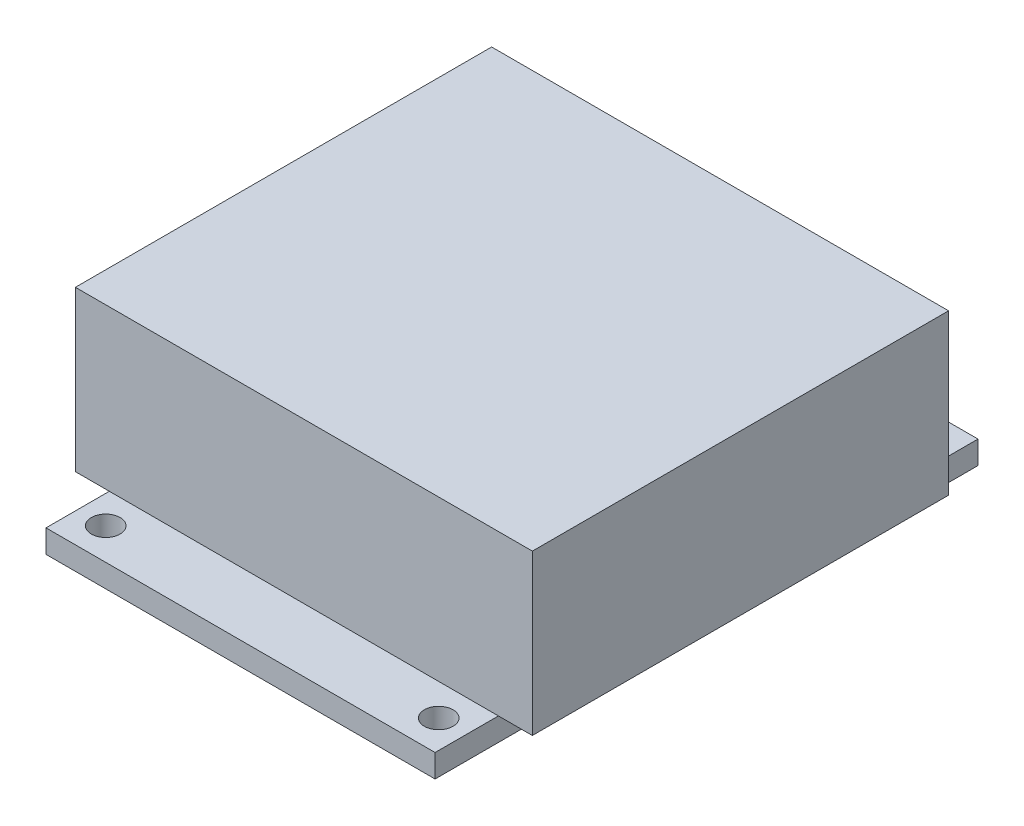
ISO-10303-21;
HEADER;
FILE_DESCRIPTION(('STEP AP214'),'2;1');
FILE_NAME('part.step','',(''),(''),'','','');
FILE_SCHEMA(('AUTOMOTIVE_DESIGN { 1 0 10303 214 1 1 1 1 }'));
ENDSEC;
DATA;
#1=APPLICATION_CONTEXT('core data for automotive mechanical design processes');
#2=APPLICATION_PROTOCOL_DEFINITION('international standard','automotive_design',2000,#1);
#3=PRODUCT_CONTEXT('',#1,'mechanical');
#4=PRODUCT('Part','Part','',(#3));
#5=PRODUCT_RELATED_PRODUCT_CATEGORY('part','',(#4));
#6=PRODUCT_DEFINITION_FORMATION('','',#4);
#7=PRODUCT_DEFINITION_CONTEXT('part definition',#1,'design');
#8=PRODUCT_DEFINITION('design','',#6,#7);
#9=PRODUCT_DEFINITION_SHAPE('','',#8);
#10=(LENGTH_UNIT() NAMED_UNIT(*) SI_UNIT(.MILLI.,.METRE.));
#11=(NAMED_UNIT(*) PLANE_ANGLE_UNIT() SI_UNIT($,.RADIAN.));
#12=(NAMED_UNIT(*) SI_UNIT($,.STERADIAN.) SOLID_ANGLE_UNIT());
#13=UNCERTAINTY_MEASURE_WITH_UNIT(LENGTH_MEASURE(1.E-05),#10,'distance_accuracy_value','');
#14=(GEOMETRIC_REPRESENTATION_CONTEXT(3) GLOBAL_UNCERTAINTY_ASSIGNED_CONTEXT((#13)) GLOBAL_UNIT_ASSIGNED_CONTEXT((#10,
#11,#12)) REPRESENTATION_CONTEXT('',''));
#15=CARTESIAN_POINT('',(0.,0.,0.));
#16=DIRECTION('',(0.,0.,1.));
#17=DIRECTION('',(1.,0.,0.));
#18=AXIS2_PLACEMENT_3D('',#15,#16,#17);
#19=CARTESIAN_POINT('',(0.,2.54,0.));
#20=DIRECTION('',(0.,1.,0.));
#21=DIRECTION('',(0.,0.,1.));
#22=AXIS2_PLACEMENT_3D('',#19,#20,#21);
#23=PLANE('',#22);
#24=DIRECTION('',(-1.,0.,0.));
#25=VECTOR('',#24,1.);
#26=CARTESIAN_POINT('',(25.25,2.54,-23.));
#27=LINE('',#26,#25);
#28=CARTESIAN_POINT('',(21.5,2.54,-23.));
#29=VERTEX_POINT('',#28);
#30=CARTESIAN_POINT('',(-21.5,2.54,-23.));
#31=VERTEX_POINT('',#30);
#32=EDGE_CURVE('E11',#29,#31,#27,.T.);
#33=ORIENTED_EDGE('',*,*,#32,.F.);
#34=DIRECTION('',(0.,0.,-1.));
#35=VECTOR('',#34,1.);
#36=CARTESIAN_POINT('',(21.5,2.54,30.));
#37=LINE('',#36,#35);
#38=CARTESIAN_POINT('',(21.5,2.54,-30.));
#39=VERTEX_POINT('',#38);
#40=EDGE_CURVE('E172',#29,#39,#37,.T.);
#41=ORIENTED_EDGE('',*,*,#40,.T.);
#42=DIRECTION('',(-1.,0.,0.));
#43=VECTOR('',#42,1.);
#44=CARTESIAN_POINT('',(21.5,2.54,-30.));
#45=LINE('',#44,#43);
#46=CARTESIAN_POINT('',(-21.5,2.54,-30.));
#47=VERTEX_POINT('',#46);
#48=EDGE_CURVE('E175',#39,#47,#45,.T.);
#49=ORIENTED_EDGE('',*,*,#48,.T.);
#50=DIRECTION('',(0.,0.,1.));
#51=VECTOR('',#50,1.);
#52=CARTESIAN_POINT('',(-21.5,2.54,30.));
#53=LINE('',#52,#51);
#54=EDGE_CURVE('E166',#47,#31,#53,.T.);
#55=ORIENTED_EDGE('',*,*,#54,.T.);
#56=EDGE_LOOP('',(#33,#41,#49,#55));
#57=FACE_BOUND('',#56,.T.);
#58=CARTESIAN_POINT('',(18.4,2.54,-26.5));
#59=DIRECTION('',(0.,1.,0.));
#60=DIRECTION('',(0.,0.,1.));
#61=AXIS2_PLACEMENT_3D('',#58,#59,#60);
#62=CIRCLE('',#61,1.5875);
#63=CARTESIAN_POINT('',(18.4,2.54,-24.9125));
#64=VERTEX_POINT('',#63);
#65=EDGE_CURVE('E154',#64,#64,#62,.T.);
#66=ORIENTED_EDGE('',*,*,#65,.F.);
#67=EDGE_LOOP('',(#66));
#68=FACE_BOUND('',#67,.T.);
#69=CARTESIAN_POINT('',(-18.4,2.54,-26.5));
#70=DIRECTION('',(0.,1.,0.));
#71=DIRECTION('',(0.,0.,1.));
#72=AXIS2_PLACEMENT_3D('',#69,#70,#71);
#73=CIRCLE('',#72,1.5875);
#74=CARTESIAN_POINT('',(-18.4,2.54,-24.9125));
#75=VERTEX_POINT('',#74);
#76=EDGE_CURVE('E160',#75,#75,#73,.T.);
#77=ORIENTED_EDGE('',*,*,#76,.F.);
#78=EDGE_LOOP('',(#77));
#79=FACE_BOUND('',#78,.T.);
#80=ADVANCED_FACE('F32',(#57,#68,#79),#23,.T.);
#81=DIRECTION('',(1.,0.,0.));
#82=VECTOR('',#81,1.);
#83=CARTESIAN_POINT('',(25.25,2.54,23.));
#84=LINE('',#83,#82);
#85=CARTESIAN_POINT('',(-21.5,2.54,23.));
#86=VERTEX_POINT('',#85);
#87=CARTESIAN_POINT('',(21.5,2.54,23.));
#88=VERTEX_POINT('',#87);
#89=EDGE_CURVE('E41',#86,#88,#84,.T.);
#90=ORIENTED_EDGE('',*,*,#89,.F.);
#91=CARTESIAN_POINT('',(-21.5,2.54,30.));
#92=VERTEX_POINT('',#91);
#93=EDGE_CURVE('E170',#86,#92,#53,.T.);
#94=ORIENTED_EDGE('',*,*,#93,.T.);
#95=DIRECTION('',(1.,0.,0.));
#96=VECTOR('',#95,1.);
#97=CARTESIAN_POINT('',(21.5,2.54,30.));
#98=LINE('',#97,#96);
#99=CARTESIAN_POINT('',(21.5,2.54,30.));
#100=VERTEX_POINT('',#99);
#101=EDGE_CURVE('E168',#92,#100,#98,.T.);
#102=ORIENTED_EDGE('',*,*,#101,.T.);
#103=EDGE_CURVE('E173',#100,#88,#37,.T.);
#104=ORIENTED_EDGE('',*,*,#103,.T.);
#105=EDGE_LOOP('',(#90,#94,#102,#104));
#106=FACE_BOUND('',#105,.T.);
#107=CARTESIAN_POINT('',(18.4,2.54,26.5));
#108=DIRECTION('',(0.,1.,0.));
#109=DIRECTION('',(0.,0.,1.));
#110=AXIS2_PLACEMENT_3D('',#107,#108,#109);
#111=CIRCLE('',#110,1.5875);
#112=CARTESIAN_POINT('',(18.4,2.54,28.0875));
#113=VERTEX_POINT('',#112);
#114=EDGE_CURVE('E148',#113,#113,#111,.T.);
#115=ORIENTED_EDGE('',*,*,#114,.F.);
#116=EDGE_LOOP('',(#115));
#117=FACE_BOUND('',#116,.T.);
#118=CARTESIAN_POINT('',(-18.4,2.54,26.5));
#119=DIRECTION('',(0.,1.,0.));
#120=DIRECTION('',(0.,0.,1.));
#121=AXIS2_PLACEMENT_3D('',#118,#119,#120);
#122=CIRCLE('',#121,1.5875);
#123=CARTESIAN_POINT('',(-18.4,2.54,28.0875));
#124=VERTEX_POINT('',#123);
#125=EDGE_CURVE('E139',#124,#124,#122,.T.);
#126=ORIENTED_EDGE('',*,*,#125,.F.);
#127=EDGE_LOOP('',(#126));
#128=FACE_BOUND('',#127,.T.);
#129=ADVANCED_FACE('F240',(#106,#117,#128),#23,.T.);
#130=CARTESIAN_POINT('',(0.,0.,0.));
#131=DIRECTION('',(0.,1.,0.));
#132=DIRECTION('',(0.,0.,1.));
#133=AXIS2_PLACEMENT_3D('',#130,#131,#132);
#134=PLANE('',#133);
#135=CARTESIAN_POINT('',(18.4,0.,26.5));
#136=DIRECTION('',(0.,1.,0.));
#137=DIRECTION('',(0.,0.,1.));
#138=AXIS2_PLACEMENT_3D('',#135,#136,#137);
#139=CIRCLE('',#138,1.5875);
#140=CARTESIAN_POINT('',(18.4,0.,28.0875));
#141=VERTEX_POINT('',#140);
#142=EDGE_CURVE('E146',#141,#141,#139,.T.);
#143=ORIENTED_EDGE('',*,*,#142,.T.);
#144=EDGE_LOOP('',(#143));
#145=FACE_BOUND('',#144,.T.);
#146=CARTESIAN_POINT('',(-18.4,0.,-26.5));
#147=DIRECTION('',(0.,1.,0.));
#148=DIRECTION('',(0.,0.,1.));
#149=AXIS2_PLACEMENT_3D('',#146,#147,#148);
#150=CIRCLE('',#149,1.5875);
#151=CARTESIAN_POINT('',(-18.4,0.,-24.9125));
#152=VERTEX_POINT('',#151);
#153=EDGE_CURVE('E157',#152,#152,#150,.T.);
#154=ORIENTED_EDGE('',*,*,#153,.T.);
#155=EDGE_LOOP('',(#154));
#156=FACE_BOUND('',#155,.T.);
#157=DIRECTION('',(0.,0.,1.));
#158=VECTOR('',#157,1.);
#159=CARTESIAN_POINT('',(-21.5,0.,30.));
#160=LINE('',#159,#158);
#161=CARTESIAN_POINT('',(-21.5,0.,-30.));
#162=VERTEX_POINT('',#161);
#163=CARTESIAN_POINT('',(-21.5,0.,30.));
#164=VERTEX_POINT('',#163);
#165=EDGE_CURVE('E163',#162,#164,#160,.T.);
#166=ORIENTED_EDGE('',*,*,#165,.F.);
#167=DIRECTION('',(-1.,0.,0.));
#168=VECTOR('',#167,1.);
#169=CARTESIAN_POINT('',(21.5,0.,-30.));
#170=LINE('',#169,#168);
#171=CARTESIAN_POINT('',(21.5,0.,-30.));
#172=VERTEX_POINT('',#171);
#173=EDGE_CURVE('E185',#172,#162,#170,.T.);
#174=ORIENTED_EDGE('',*,*,#173,.F.);
#175=DIRECTION('',(0.,0.,-1.));
#176=VECTOR('',#175,1.);
#177=CARTESIAN_POINT('',(21.5,0.,30.));
#178=LINE('',#177,#176);
#179=CARTESIAN_POINT('',(21.5,0.,30.));
#180=VERTEX_POINT('',#179);
#181=EDGE_CURVE('E183',#180,#172,#178,.T.);
#182=ORIENTED_EDGE('',*,*,#181,.F.);
#183=DIRECTION('',(1.,0.,0.));
#184=VECTOR('',#183,1.);
#185=CARTESIAN_POINT('',(21.5,0.,30.));
#186=LINE('',#185,#184);
#187=EDGE_CURVE('E181',#164,#180,#186,.T.);
#188=ORIENTED_EDGE('',*,*,#187,.F.);
#189=EDGE_LOOP('',(#166,#174,#182,#188));
#190=FACE_BOUND('',#189,.T.);
#191=CARTESIAN_POINT('',(18.4,0.,-26.5));
#192=DIRECTION('',(0.,1.,0.));
#193=DIRECTION('',(0.,0.,1.));
#194=AXIS2_PLACEMENT_3D('',#191,#192,#193);
#195=CIRCLE('',#194,1.5875);
#196=CARTESIAN_POINT('',(18.4,0.,-24.9125));
#197=VERTEX_POINT('',#196);
#198=EDGE_CURVE('E151',#197,#197,#195,.T.);
#199=ORIENTED_EDGE('',*,*,#198,.T.);
#200=EDGE_LOOP('',(#199));
#201=FACE_BOUND('',#200,.T.);
#202=CARTESIAN_POINT('',(-18.4,0.,26.5));
#203=DIRECTION('',(0.,1.,0.));
#204=DIRECTION('',(0.,0.,1.));
#205=AXIS2_PLACEMENT_3D('',#202,#203,#204);
#206=CIRCLE('',#205,1.5875);
#207=CARTESIAN_POINT('',(-18.4,0.,28.0875));
#208=VERTEX_POINT('',#207);
#209=EDGE_CURVE('E136',#208,#208,#206,.T.);
#210=ORIENTED_EDGE('',*,*,#209,.T.);
#211=EDGE_LOOP('',(#210));
#212=FACE_BOUND('',#211,.T.);
#213=ADVANCED_FACE('F244',(#145,#156,#190,#201,#212),#134,.F.);
#214=CARTESIAN_POINT('',(-21.5,2.54,30.));
#215=DIRECTION('',(1.,0.,0.));
#216=DIRECTION('',(0.,0.,-1.));
#217=AXIS2_PLACEMENT_3D('',#214,#215,#216);
#218=PLANE('',#217);
#219=ORIENTED_EDGE('',*,*,#165,.T.);
#220=DIRECTION('',(0.,-1.,0.));
#221=VECTOR('',#220,1.);
#222=CARTESIAN_POINT('',(-21.5,2.54,30.));
#223=LINE('',#222,#221);
#224=EDGE_CURVE('E36',#92,#164,#223,.T.);
#225=ORIENTED_EDGE('',*,*,#224,.F.);
#226=ORIENTED_EDGE('',*,*,#93,.F.);
#227=EDGE_CURVE('E169',#31,#86,#53,.T.);
#228=ORIENTED_EDGE('',*,*,#227,.F.);
#229=ORIENTED_EDGE('',*,*,#54,.F.);
#230=DIRECTION('',(0.,-1.,0.));
#231=VECTOR('',#230,1.);
#232=CARTESIAN_POINT('',(-21.5,2.54,-30.));
#233=LINE('',#232,#231);
#234=EDGE_CURVE('E178',#47,#162,#233,.T.);
#235=ORIENTED_EDGE('',*,*,#234,.T.);
#236=EDGE_LOOP('',(#219,#225,#226,#228,#229,#235));
#237=FACE_BOUND('',#236,.T.);
#238=ADVANCED_FACE('F34',(#237),#218,.F.);
#239=CARTESIAN_POINT('',(21.5,2.54,30.));
#240=DIRECTION('',(0.,0.,-1.));
#241=DIRECTION('',(-1.,0.,0.));
#242=AXIS2_PLACEMENT_3D('',#239,#240,#241);
#243=PLANE('',#242);
#244=ORIENTED_EDGE('',*,*,#187,.T.);
#245=DIRECTION('',(0.,-1.,0.));
#246=VECTOR('',#245,1.);
#247=CARTESIAN_POINT('',(21.5,2.54,30.));
#248=LINE('',#247,#246);
#249=EDGE_CURVE('E191',#100,#180,#248,.T.);
#250=ORIENTED_EDGE('',*,*,#249,.F.);
#251=ORIENTED_EDGE('',*,*,#101,.F.);
#252=ORIENTED_EDGE('',*,*,#224,.T.);
#253=EDGE_LOOP('',(#244,#250,#251,#252));
#254=FACE_BOUND('',#253,.T.);
#255=ADVANCED_FACE('F242',(#254),#243,.F.);
#256=CARTESIAN_POINT('',(21.5,2.54,30.));
#257=DIRECTION('',(-1.,0.,0.));
#258=DIRECTION('',(0.,0.,1.));
#259=AXIS2_PLACEMENT_3D('',#256,#257,#258);
#260=PLANE('',#259);
#261=ORIENTED_EDGE('',*,*,#181,.T.);
#262=DIRECTION('',(0.,-1.,0.));
#263=VECTOR('',#262,1.);
#264=CARTESIAN_POINT('',(21.5,2.54,-30.));
#265=LINE('',#264,#263);
#266=EDGE_CURVE('E189',#39,#172,#265,.T.);
#267=ORIENTED_EDGE('',*,*,#266,.F.);
#268=ORIENTED_EDGE('',*,*,#40,.F.);
#269=EDGE_CURVE('E176',#88,#29,#37,.T.);
#270=ORIENTED_EDGE('',*,*,#269,.F.);
#271=ORIENTED_EDGE('',*,*,#103,.F.);
#272=ORIENTED_EDGE('',*,*,#249,.T.);
#273=EDGE_LOOP('',(#261,#267,#268,#270,#271,#272));
#274=FACE_BOUND('',#273,.T.);
#275=ADVANCED_FACE('F230',(#274),#260,.F.);
#276=CARTESIAN_POINT('',(21.5,2.54,-30.));
#277=DIRECTION('',(0.,0.,1.));
#278=DIRECTION('',(1.,0.,0.));
#279=AXIS2_PLACEMENT_3D('',#276,#277,#278);
#280=PLANE('',#279);
#281=ORIENTED_EDGE('',*,*,#173,.T.);
#282=ORIENTED_EDGE('',*,*,#234,.F.);
#283=ORIENTED_EDGE('',*,*,#48,.F.);
#284=ORIENTED_EDGE('',*,*,#266,.T.);
#285=EDGE_LOOP('',(#281,#282,#283,#284));
#286=FACE_BOUND('',#285,.T.);
#287=ADVANCED_FACE('F233',(#286),#280,.F.);
#288=CARTESIAN_POINT('',(-18.4,2.54,-26.5));
#289=DIRECTION('',(0.,-1.,0.));
#290=DIRECTION('',(0.,0.,-1.));
#291=AXIS2_PLACEMENT_3D('',#288,#289,#290);
#292=CYLINDRICAL_SURFACE('',#291,1.5875);
#293=ORIENTED_EDGE('',*,*,#76,.T.);
#294=EDGE_LOOP('',(#293));
#295=FACE_BOUND('',#294,.T.);
#296=ORIENTED_EDGE('',*,*,#153,.F.);
#297=EDGE_LOOP('',(#296));
#298=FACE_BOUND('',#297,.T.);
#299=ADVANCED_FACE('F273',(#295,#298),#292,.F.);
#300=CARTESIAN_POINT('',(18.4,2.54,-26.5));
#301=DIRECTION('',(0.,-1.,0.));
#302=DIRECTION('',(0.,0.,-1.));
#303=AXIS2_PLACEMENT_3D('',#300,#301,#302);
#304=CYLINDRICAL_SURFACE('',#303,1.5875);
#305=ORIENTED_EDGE('',*,*,#65,.T.);
#306=EDGE_LOOP('',(#305));
#307=FACE_BOUND('',#306,.T.);
#308=ORIENTED_EDGE('',*,*,#198,.F.);
#309=EDGE_LOOP('',(#308));
#310=FACE_BOUND('',#309,.T.);
#311=ADVANCED_FACE('F263',(#307,#310),#304,.F.);
#312=CARTESIAN_POINT('',(18.4,2.54,26.5));
#313=DIRECTION('',(0.,-1.,0.));
#314=DIRECTION('',(0.,0.,-1.));
#315=AXIS2_PLACEMENT_3D('',#312,#313,#314);
#316=CYLINDRICAL_SURFACE('',#315,1.5875);
#317=ORIENTED_EDGE('',*,*,#114,.T.);
#318=EDGE_LOOP('',(#317));
#319=FACE_BOUND('',#318,.T.);
#320=ORIENTED_EDGE('',*,*,#142,.F.);
#321=EDGE_LOOP('',(#320));
#322=FACE_BOUND('',#321,.T.);
#323=ADVANCED_FACE('F255',(#319,#322),#316,.F.);
#324=CARTESIAN_POINT('',(-18.4,2.54,26.5));
#325=DIRECTION('',(0.,-1.,0.));
#326=DIRECTION('',(0.,0.,-1.));
#327=AXIS2_PLACEMENT_3D('',#324,#325,#326);
#328=CYLINDRICAL_SURFACE('',#327,1.5875);
#329=ORIENTED_EDGE('',*,*,#125,.T.);
#330=EDGE_LOOP('',(#329));
#331=FACE_BOUND('',#330,.T.);
#332=ORIENTED_EDGE('',*,*,#209,.F.);
#333=EDGE_LOOP('',(#332));
#334=FACE_BOUND('',#333,.T.);
#335=ADVANCED_FACE('F253',(#331,#334),#328,.F.);
#336=CARTESIAN_POINT('',(0.,2.54,0.));
#337=DIRECTION('',(0.,1.,0.));
#338=DIRECTION('',(0.,0.,1.));
#339=AXIS2_PLACEMENT_3D('',#336,#337,#338);
#340=PLANE('',#339);
#341=CARTESIAN_POINT('',(-25.25,2.54,-23.));
#342=VERTEX_POINT('',#341);
#343=EDGE_CURVE('E44',#31,#342,#27,.T.);
#344=ORIENTED_EDGE('',*,*,#343,.F.);
#345=ORIENTED_EDGE('',*,*,#227,.T.);
#346=CARTESIAN_POINT('',(-25.25,2.54,23.));
#347=VERTEX_POINT('',#346);
#348=EDGE_CURVE('E202',#347,#86,#84,.T.);
#349=ORIENTED_EDGE('',*,*,#348,.F.);
#350=DIRECTION('',(0.,0.,1.));
#351=VECTOR('',#350,1.);
#352=CARTESIAN_POINT('',(-25.25,2.54,23.));
#353=LINE('',#352,#351);
#354=EDGE_CURVE('E135',#342,#347,#353,.T.);
#355=ORIENTED_EDGE('',*,*,#354,.F.);
#356=EDGE_LOOP('',(#344,#345,#349,#355));
#357=FACE_BOUND('',#356,.T.);
#358=ADVANCED_FACE('F239',(#357),#340,.F.);
#359=CARTESIAN_POINT('',(25.25,2.54,23.));
#360=VERTEX_POINT('',#359);
#361=EDGE_CURVE('E203',#88,#360,#84,.T.);
#362=ORIENTED_EDGE('',*,*,#361,.F.);
#363=ORIENTED_EDGE('',*,*,#269,.T.);
#364=CARTESIAN_POINT('',(25.25,2.54,-23.));
#365=VERTEX_POINT('',#364);
#366=EDGE_CURVE('E43',#365,#29,#27,.T.);
#367=ORIENTED_EDGE('',*,*,#366,.F.);
#368=DIRECTION('',(0.,0.,-1.));
#369=VECTOR('',#368,1.);
#370=CARTESIAN_POINT('',(25.25,2.54,23.));
#371=LINE('',#370,#369);
#372=EDGE_CURVE('E206',#360,#365,#371,.T.);
#373=ORIENTED_EDGE('',*,*,#372,.F.);
#374=EDGE_LOOP('',(#362,#363,#367,#373));
#375=FACE_BOUND('',#374,.T.);
#376=ADVANCED_FACE('F224',(#375),#340,.F.);
#377=CARTESIAN_POINT('',(-25.25,20.19,23.));
#378=DIRECTION('',(1.,0.,0.));
#379=DIRECTION('',(0.,0.,-1.));
#380=AXIS2_PLACEMENT_3D('',#377,#378,#379);
#381=PLANE('',#380);
#382=ORIENTED_EDGE('',*,*,#354,.T.);
#383=DIRECTION('',(0.,-1.,0.));
#384=VECTOR('',#383,1.);
#385=CARTESIAN_POINT('',(-25.25,20.19,23.));
#386=LINE('',#385,#384);
#387=CARTESIAN_POINT('',(-25.25,20.19,23.));
#388=VERTEX_POINT('',#387);
#389=EDGE_CURVE('E116',#388,#347,#386,.T.);
#390=ORIENTED_EDGE('',*,*,#389,.F.);
#391=DIRECTION('',(0.,0.,1.));
#392=VECTOR('',#391,1.);
#393=CARTESIAN_POINT('',(-25.25,20.19,23.));
#394=LINE('',#393,#392);
#395=CARTESIAN_POINT('',(-25.25,20.19,-23.));
#396=VERTEX_POINT('',#395);
#397=EDGE_CURVE('E123',#396,#388,#394,.T.);
#398=ORIENTED_EDGE('',*,*,#397,.F.);
#399=DIRECTION('',(0.,-1.,0.));
#400=VECTOR('',#399,1.);
#401=CARTESIAN_POINT('',(-25.25,20.19,-23.));
#402=LINE('',#401,#400);
#403=EDGE_CURVE('E210',#396,#342,#402,.T.);
#404=ORIENTED_EDGE('',*,*,#403,.T.);
#405=EDGE_LOOP('',(#382,#390,#398,#404));
#406=FACE_BOUND('',#405,.T.);
#407=ADVANCED_FACE('F133',(#406),#381,.F.);
#408=CARTESIAN_POINT('',(25.25,20.19,23.));
#409=DIRECTION('',(0.,0.,-1.));
#410=DIRECTION('',(-1.,0.,0.));
#411=AXIS2_PLACEMENT_3D('',#408,#409,#410);
#412=PLANE('',#411);
#413=ORIENTED_EDGE('',*,*,#348,.T.);
#414=ORIENTED_EDGE('',*,*,#89,.T.);
#415=ORIENTED_EDGE('',*,*,#361,.T.);
#416=DIRECTION('',(0.,-1.,0.));
#417=VECTOR('',#416,1.);
#418=CARTESIAN_POINT('',(25.25,20.19,23.));
#419=LINE('',#418,#417);
#420=CARTESIAN_POINT('',(25.25,20.19,23.));
#421=VERTEX_POINT('',#420);
#422=EDGE_CURVE('E119',#421,#360,#419,.T.);
#423=ORIENTED_EDGE('',*,*,#422,.F.);
#424=DIRECTION('',(1.,0.,0.));
#425=VECTOR('',#424,1.);
#426=CARTESIAN_POINT('',(25.25,20.19,23.));
#427=LINE('',#426,#425);
#428=EDGE_CURVE('E111',#388,#421,#427,.T.);
#429=ORIENTED_EDGE('',*,*,#428,.F.);
#430=ORIENTED_EDGE('',*,*,#389,.T.);
#431=EDGE_LOOP('',(#413,#414,#415,#423,#429,#430));
#432=FACE_BOUND('',#431,.T.);
#433=ADVANCED_FACE('F114',(#432),#412,.F.);
#434=CARTESIAN_POINT('',(25.25,20.19,23.));
#435=DIRECTION('',(-1.,0.,0.));
#436=DIRECTION('',(0.,0.,1.));
#437=AXIS2_PLACEMENT_3D('',#434,#435,#436);
#438=PLANE('',#437);
#439=ORIENTED_EDGE('',*,*,#372,.T.);
#440=DIRECTION('',(0.,-1.,0.));
#441=VECTOR('',#440,1.);
#442=CARTESIAN_POINT('',(25.25,20.19,-23.));
#443=LINE('',#442,#441);
#444=CARTESIAN_POINT('',(25.25,20.19,-23.));
#445=VERTEX_POINT('',#444);
#446=EDGE_CURVE('E141',#445,#365,#443,.T.);
#447=ORIENTED_EDGE('',*,*,#446,.F.);
#448=DIRECTION('',(0.,0.,-1.));
#449=VECTOR('',#448,1.);
#450=CARTESIAN_POINT('',(25.25,20.19,23.));
#451=LINE('',#450,#449);
#452=EDGE_CURVE('E122',#421,#445,#451,.T.);
#453=ORIENTED_EDGE('',*,*,#452,.F.);
#454=ORIENTED_EDGE('',*,*,#422,.T.);
#455=EDGE_LOOP('',(#439,#447,#453,#454));
#456=FACE_BOUND('',#455,.T.);
#457=ADVANCED_FACE('F214',(#456),#438,.F.);
#458=CARTESIAN_POINT('',(25.25,20.19,-23.));
#459=DIRECTION('',(0.,0.,1.));
#460=DIRECTION('',(1.,0.,0.));
#461=AXIS2_PLACEMENT_3D('',#458,#459,#460);
#462=PLANE('',#461);
#463=ORIENTED_EDGE('',*,*,#366,.T.);
#464=ORIENTED_EDGE('',*,*,#32,.T.);
#465=ORIENTED_EDGE('',*,*,#343,.T.);
#466=ORIENTED_EDGE('',*,*,#403,.F.);
#467=DIRECTION('',(-1.,0.,0.));
#468=VECTOR('',#467,1.);
#469=CARTESIAN_POINT('',(25.25,20.19,-23.));
#470=LINE('',#469,#468);
#471=EDGE_CURVE('E128',#445,#396,#470,.T.);
#472=ORIENTED_EDGE('',*,*,#471,.F.);
#473=ORIENTED_EDGE('',*,*,#446,.T.);
#474=EDGE_LOOP('',(#463,#464,#465,#466,#472,#473));
#475=FACE_BOUND('',#474,.T.);
#476=ADVANCED_FACE('F219',(#475),#462,.F.);
#477=CARTESIAN_POINT('',(0.,20.19,0.));
#478=DIRECTION('',(0.,1.,0.));
#479=DIRECTION('',(0.,0.,1.));
#480=AXIS2_PLACEMENT_3D('',#477,#478,#479);
#481=PLANE('',#480);
#482=ORIENTED_EDGE('',*,*,#397,.T.);
#483=ORIENTED_EDGE('',*,*,#428,.T.);
#484=ORIENTED_EDGE('',*,*,#452,.T.);
#485=ORIENTED_EDGE('',*,*,#471,.T.);
#486=EDGE_LOOP('',(#482,#483,#484,#485));
#487=FACE_BOUND('',#486,.T.);
#488=ADVANCED_FACE('F126',(#487),#481,.T.);
#489=CLOSED_SHELL('',(#80,#129,#213,#238,#255,#275,#287,#299,#311,#323,#335,#358,#376,#407,#433,
#457,#476,#488));
#490=MANIFOLD_SOLID_BREP('B2',#489);
#491=ADVANCED_BREP_SHAPE_REPRESENTATION('',(#18,#490),#14);
#492=SHAPE_DEFINITION_REPRESENTATION(#9,#491);
ENDSEC;
END-ISO-10303-21;
